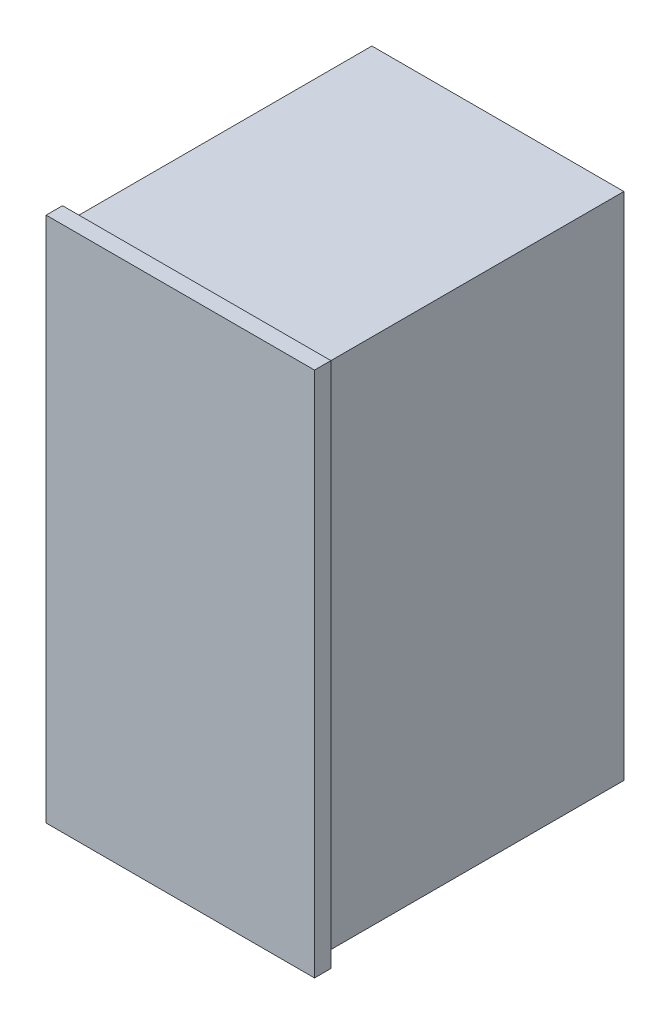
ISO-10303-21;
HEADER;
FILE_DESCRIPTION(('STEP AP214'),'2;1');
FILE_NAME('part.step','',(''),(''),'','','');
FILE_SCHEMA(('AUTOMOTIVE_DESIGN { 1 0 10303 214 1 1 1 1 }'));
ENDSEC;
DATA;
#1=APPLICATION_CONTEXT('core data for automotive mechanical design processes');
#2=APPLICATION_PROTOCOL_DEFINITION('international standard','automotive_design',2000,#1);
#3=PRODUCT_CONTEXT('',#1,'mechanical');
#4=PRODUCT('Part','Part','',(#3));
#5=PRODUCT_RELATED_PRODUCT_CATEGORY('part','',(#4));
#6=PRODUCT_DEFINITION_FORMATION('','',#4);
#7=PRODUCT_DEFINITION_CONTEXT('part definition',#1,'design');
#8=PRODUCT_DEFINITION('design','',#6,#7);
#9=PRODUCT_DEFINITION_SHAPE('','',#8);
#10=(LENGTH_UNIT() NAMED_UNIT(*) SI_UNIT(.MILLI.,.METRE.));
#11=(NAMED_UNIT(*) PLANE_ANGLE_UNIT() SI_UNIT($,.RADIAN.));
#12=(NAMED_UNIT(*) SI_UNIT($,.STERADIAN.) SOLID_ANGLE_UNIT());
#13=UNCERTAINTY_MEASURE_WITH_UNIT(LENGTH_MEASURE(1.E-05),#10,'distance_accuracy_value','');
#14=(GEOMETRIC_REPRESENTATION_CONTEXT(3) GLOBAL_UNCERTAINTY_ASSIGNED_CONTEXT((#13)) GLOBAL_UNIT_ASSIGNED_CONTEXT((#10,
#11,#12)) REPRESENTATION_CONTEXT('',''));
#15=CARTESIAN_POINT('',(0.,0.,0.));
#16=DIRECTION('',(0.,0.,1.));
#17=DIRECTION('',(1.,0.,0.));
#18=AXIS2_PLACEMENT_3D('',#15,#16,#17);
#19=CARTESIAN_POINT('',(0.,249.,0.));
#20=DIRECTION('',(1.,0.,0.));
#21=DIRECTION('',(0.,0.,-1.));
#22=AXIS2_PLACEMENT_3D('',#19,#20,#21);
#23=PLANE('',#22);
#24=DIRECTION('',(0.,0.,1.));
#25=VECTOR('',#24,1.);
#26=CARTESIAN_POINT('',(0.,0.,0.));
#27=LINE('',#26,#25);
#28=CARTESIAN_POINT('',(0.,0.,-147.));
#29=VERTEX_POINT('',#28);
#30=CARTESIAN_POINT('',(0.,0.,0.));
#31=VERTEX_POINT('',#30);
#32=EDGE_CURVE('E165',#29,#31,#27,.T.);
#33=ORIENTED_EDGE('',*,*,#32,.T.);
#34=DIRECTION('',(0.,-1.,0.));
#35=VECTOR('',#34,1.);
#36=CARTESIAN_POINT('',(0.,249.,0.));
#37=LINE('',#36,#35);
#38=CARTESIAN_POINT('',(0.,249.,0.));
#39=VERTEX_POINT('',#38);
#40=EDGE_CURVE('E11',#39,#31,#37,.T.);
#41=ORIENTED_EDGE('',*,*,#40,.F.);
#42=DIRECTION('',(0.,0.,1.));
#43=VECTOR('',#42,1.);
#44=CARTESIAN_POINT('',(0.,249.,0.));
#45=LINE('',#44,#43);
#46=CARTESIAN_POINT('',(0.,249.,-147.));
#47=VERTEX_POINT('',#46);
#48=EDGE_CURVE('E85',#47,#39,#45,.T.);
#49=ORIENTED_EDGE('',*,*,#48,.F.);
#50=DIRECTION('',(0.,-1.,0.));
#51=VECTOR('',#50,1.);
#52=CARTESIAN_POINT('',(0.,249.,-147.));
#53=LINE('',#52,#51);
#54=EDGE_CURVE('E181',#47,#29,#53,.T.);
#55=ORIENTED_EDGE('',*,*,#54,.T.);
#56=EDGE_LOOP('',(#33,#41,#49,#55));
#57=FACE_BOUND('',#56,.T.);
#58=ADVANCED_FACE('F43',(#57),#23,.F.);
#59=CARTESIAN_POINT('',(123.,249.,0.));
#60=DIRECTION('',(-1.,0.,0.));
#61=DIRECTION('',(0.,0.,1.));
#62=AXIS2_PLACEMENT_3D('',#59,#60,#61);
#63=PLANE('',#62);
#64=DIRECTION('',(0.,0.,-1.));
#65=VECTOR('',#64,1.);
#66=CARTESIAN_POINT('',(123.,0.,0.));
#67=LINE('',#66,#65);
#68=CARTESIAN_POINT('',(123.,0.,0.));
#69=VERTEX_POINT('',#68);
#70=CARTESIAN_POINT('',(123.,0.,-147.));
#71=VERTEX_POINT('',#70);
#72=EDGE_CURVE('E74',#69,#71,#67,.T.);
#73=ORIENTED_EDGE('',*,*,#72,.T.);
#74=DIRECTION('',(0.,-1.,0.));
#75=VECTOR('',#74,1.);
#76=CARTESIAN_POINT('',(123.,249.,-147.));
#77=LINE('',#76,#75);
#78=CARTESIAN_POINT('',(123.,249.,-147.));
#79=VERTEX_POINT('',#78);
#80=EDGE_CURVE('E194',#79,#71,#77,.T.);
#81=ORIENTED_EDGE('',*,*,#80,.F.);
#82=DIRECTION('',(0.,0.,-1.));
#83=VECTOR('',#82,1.);
#84=CARTESIAN_POINT('',(123.,249.,0.));
#85=LINE('',#84,#83);
#86=CARTESIAN_POINT('',(123.,249.,0.));
#87=VERTEX_POINT('',#86);
#88=EDGE_CURVE('E176',#87,#79,#85,.T.);
#89=ORIENTED_EDGE('',*,*,#88,.F.);
#90=DIRECTION('',(0.,-1.,0.));
#91=VECTOR('',#90,1.);
#92=CARTESIAN_POINT('',(123.,249.,0.));
#93=LINE('',#92,#91);
#94=EDGE_CURVE('E52',#87,#69,#93,.T.);
#95=ORIENTED_EDGE('',*,*,#94,.T.);
#96=EDGE_LOOP('',(#73,#81,#89,#95));
#97=FACE_BOUND('',#96,.T.);
#98=ADVANCED_FACE('F199',(#97),#63,.F.);
#99=CARTESIAN_POINT('',(0.,249.,-147.));
#100=DIRECTION('',(0.,0.,1.));
#101=DIRECTION('',(1.,0.,0.));
#102=AXIS2_PLACEMENT_3D('',#99,#100,#101);
#103=PLANE('',#102);
#104=DIRECTION('',(-1.,0.,0.));
#105=VECTOR('',#104,1.);
#106=CARTESIAN_POINT('',(0.,0.,-147.));
#107=LINE('',#106,#105);
#108=EDGE_CURVE('E80',#71,#29,#107,.T.);
#109=ORIENTED_EDGE('',*,*,#108,.T.);
#110=ORIENTED_EDGE('',*,*,#54,.F.);
#111=DIRECTION('',(-1.,0.,0.));
#112=VECTOR('',#111,1.);
#113=CARTESIAN_POINT('',(0.,249.,-147.));
#114=LINE('',#113,#112);
#115=EDGE_CURVE('E60',#79,#47,#114,.T.);
#116=ORIENTED_EDGE('',*,*,#115,.F.);
#117=ORIENTED_EDGE('',*,*,#80,.T.);
#118=EDGE_LOOP('',(#109,#110,#116,#117));
#119=FACE_BOUND('',#118,.T.);
#120=ADVANCED_FACE('F209',(#119),#103,.F.);
#121=CARTESIAN_POINT('',(0.,249.,0.));
#122=DIRECTION('',(0.,-1.,0.));
#123=DIRECTION('',(0.,0.,-1.));
#124=AXIS2_PLACEMENT_3D('',#121,#122,#123);
#125=PLANE('',#124);
#126=ORIENTED_EDGE('',*,*,#48,.T.);
#127=DIRECTION('',(1.,0.,0.));
#128=VECTOR('',#127,1.);
#129=CARTESIAN_POINT('',(0.,249.,0.));
#130=LINE('',#129,#128);
#131=EDGE_CURVE('E173',#39,#87,#130,.T.);
#132=ORIENTED_EDGE('',*,*,#131,.T.);
#133=ORIENTED_EDGE('',*,*,#88,.T.);
#134=ORIENTED_EDGE('',*,*,#115,.T.);
#135=EDGE_LOOP('',(#126,#132,#133,#134));
#136=FACE_BOUND('',#135,.T.);
#137=ADVANCED_FACE('F211',(#136),#125,.F.);
#138=CARTESIAN_POINT('',(0.,0.,0.));
#139=DIRECTION('',(0.,-1.,0.));
#140=DIRECTION('',(0.,0.,-1.));
#141=AXIS2_PLACEMENT_3D('',#138,#139,#140);
#142=PLANE('',#141);
#143=ORIENTED_EDGE('',*,*,#32,.F.);
#144=ORIENTED_EDGE('',*,*,#108,.F.);
#145=ORIENTED_EDGE('',*,*,#72,.F.);
#146=DIRECTION('',(1.,0.,0.));
#147=VECTOR('',#146,1.);
#148=CARTESIAN_POINT('',(0.,0.,0.));
#149=LINE('',#148,#147);
#150=EDGE_CURVE('E184',#31,#69,#149,.T.);
#151=ORIENTED_EDGE('',*,*,#150,.F.);
#152=EDGE_LOOP('',(#143,#144,#145,#151));
#153=FACE_BOUND('',#152,.T.);
#154=ADVANCED_FACE('F205',(#153),#142,.T.);
#155=CARTESIAN_POINT('',(-4.,-4.,8.));
#156=DIRECTION('',(-1.,0.,0.));
#157=DIRECTION('',(0.,0.,1.));
#158=AXIS2_PLACEMENT_3D('',#155,#156,#157);
#159=PLANE('',#158);
#160=DIRECTION('',(0.,1.,0.));
#161=VECTOR('',#160,1.);
#162=CARTESIAN_POINT('',(-4.,-4.,8.));
#163=LINE('',#162,#161);
#164=CARTESIAN_POINT('',(-4.,-4.,8.));
#165=VERTEX_POINT('',#164);
#166=CARTESIAN_POINT('',(-4.,253.,8.));
#167=VERTEX_POINT('',#166);
#168=EDGE_CURVE('E116',#165,#167,#163,.T.);
#169=ORIENTED_EDGE('',*,*,#168,.T.);
#170=DIRECTION('',(0.,0.,1.));
#171=VECTOR('',#170,1.);
#172=CARTESIAN_POINT('',(-4.,253.,8.));
#173=LINE('',#172,#171);
#174=CARTESIAN_POINT('',(-4.,253.,0.));
#175=VERTEX_POINT('',#174);
#176=EDGE_CURVE('E120',#175,#167,#173,.T.);
#177=ORIENTED_EDGE('',*,*,#176,.F.);
#178=DIRECTION('',(0.,1.,0.));
#179=VECTOR('',#178,1.);
#180=CARTESIAN_POINT('',(-4.,-4.,0.));
#181=LINE('',#180,#179);
#182=CARTESIAN_POINT('',(-4.,-4.,0.));
#183=VERTEX_POINT('',#182);
#184=EDGE_CURVE('E162',#183,#175,#181,.T.);
#185=ORIENTED_EDGE('',*,*,#184,.F.);
#186=DIRECTION('',(0.,0.,1.));
#187=VECTOR('',#186,1.);
#188=CARTESIAN_POINT('',(-4.,-4.,8.));
#189=LINE('',#188,#187);
#190=EDGE_CURVE('E122',#183,#165,#189,.T.);
#191=ORIENTED_EDGE('',*,*,#190,.T.);
#192=EDGE_LOOP('',(#169,#177,#185,#191));
#193=FACE_BOUND('',#192,.T.);
#194=ADVANCED_FACE('F118',(#193),#159,.T.);
#195=CARTESIAN_POINT('',(-4.,-4.,0.));
#196=DIRECTION('',(0.,0.,-1.));
#197=DIRECTION('',(-1.,0.,0.));
#198=AXIS2_PLACEMENT_3D('',#195,#196,#197);
#199=PLANE('',#198);
#200=ORIENTED_EDGE('',*,*,#40,.T.);
#201=ORIENTED_EDGE('',*,*,#150,.T.);
#202=ORIENTED_EDGE('',*,*,#94,.F.);
#203=ORIENTED_EDGE('',*,*,#131,.F.);
#204=EDGE_LOOP('',(#200,#201,#202,#203));
#205=FACE_BOUND('',#204,.T.);
#206=ORIENTED_EDGE('',*,*,#184,.T.);
#207=DIRECTION('',(-1.,0.,0.));
#208=VECTOR('',#207,1.);
#209=CARTESIAN_POINT('',(-4.,253.,0.));
#210=LINE('',#209,#208);
#211=CARTESIAN_POINT('',(127.,253.,0.));
#212=VERTEX_POINT('',#211);
#213=EDGE_CURVE('E142',#212,#175,#210,.T.);
#214=ORIENTED_EDGE('',*,*,#213,.F.);
#215=DIRECTION('',(0.,1.,0.));
#216=VECTOR('',#215,1.);
#217=CARTESIAN_POINT('',(127.,-4.,0.));
#218=LINE('',#217,#216);
#219=CARTESIAN_POINT('',(127.,-4.,0.));
#220=VERTEX_POINT('',#219);
#221=EDGE_CURVE('E166',#220,#212,#218,.T.);
#222=ORIENTED_EDGE('',*,*,#221,.F.);
#223=DIRECTION('',(-1.,0.,0.));
#224=VECTOR('',#223,1.);
#225=CARTESIAN_POINT('',(-4.,-4.,0.));
#226=LINE('',#225,#224);
#227=EDGE_CURVE('E128',#220,#183,#226,.T.);
#228=ORIENTED_EDGE('',*,*,#227,.T.);
#229=EDGE_LOOP('',(#206,#214,#222,#228));
#230=FACE_BOUND('',#229,.T.);
#231=ADVANCED_FACE('F206',(#205,#230),#199,.T.);
#232=CARTESIAN_POINT('',(127.,-4.,0.));
#233=DIRECTION('',(1.,0.,0.));
#234=DIRECTION('',(0.,0.,-1.));
#235=AXIS2_PLACEMENT_3D('',#232,#233,#234);
#236=PLANE('',#235);
#237=ORIENTED_EDGE('',*,*,#221,.T.);
#238=DIRECTION('',(0.,0.,-1.));
#239=VECTOR('',#238,1.);
#240=CARTESIAN_POINT('',(127.,253.,0.));
#241=LINE('',#240,#239);
#242=CARTESIAN_POINT('',(127.,253.,7.99999999999998));
#243=VERTEX_POINT('',#242);
#244=EDGE_CURVE('E137',#243,#212,#241,.T.);
#245=ORIENTED_EDGE('',*,*,#244,.F.);
#246=DIRECTION('',(0.,1.,0.));
#247=VECTOR('',#246,1.);
#248=CARTESIAN_POINT('',(127.,-4.,7.99999999999998));
#249=LINE('',#248,#247);
#250=CARTESIAN_POINT('',(127.,-4.,7.99999999999998));
#251=VERTEX_POINT('',#250);
#252=EDGE_CURVE('E127',#251,#243,#249,.T.);
#253=ORIENTED_EDGE('',*,*,#252,.F.);
#254=DIRECTION('',(0.,0.,-1.));
#255=VECTOR('',#254,1.);
#256=CARTESIAN_POINT('',(127.,-4.,0.));
#257=LINE('',#256,#255);
#258=EDGE_CURVE('E155',#251,#220,#257,.T.);
#259=ORIENTED_EDGE('',*,*,#258,.T.);
#260=EDGE_LOOP('',(#237,#245,#253,#259));
#261=FACE_BOUND('',#260,.T.);
#262=ADVANCED_FACE('F253',(#261),#236,.T.);
#263=CARTESIAN_POINT('',(127.,-4.,7.99999999999998));
#264=DIRECTION('',(0.,0.,1.));
#265=DIRECTION('',(1.,0.,0.));
#266=AXIS2_PLACEMENT_3D('',#263,#264,#265);
#267=PLANE('',#266);
#268=ORIENTED_EDGE('',*,*,#252,.T.);
#269=DIRECTION('',(1.,0.,0.));
#270=VECTOR('',#269,1.);
#271=CARTESIAN_POINT('',(127.,253.,7.99999999999998));
#272=LINE('',#271,#270);
#273=EDGE_CURVE('E131',#167,#243,#272,.T.);
#274=ORIENTED_EDGE('',*,*,#273,.F.);
#275=ORIENTED_EDGE('',*,*,#168,.F.);
#276=DIRECTION('',(1.,0.,0.));
#277=VECTOR('',#276,1.);
#278=CARTESIAN_POINT('',(127.,-4.,7.99999999999998));
#279=LINE('',#278,#277);
#280=EDGE_CURVE('E152',#165,#251,#279,.T.);
#281=ORIENTED_EDGE('',*,*,#280,.T.);
#282=EDGE_LOOP('',(#268,#274,#275,#281));
#283=FACE_BOUND('',#282,.T.);
#284=ADVANCED_FACE('F132',(#283),#267,.T.);
#285=CARTESIAN_POINT('',(0.,-4.,0.));
#286=DIRECTION('',(0.,-1.,0.));
#287=DIRECTION('',(0.,0.,-1.));
#288=AXIS2_PLACEMENT_3D('',#285,#286,#287);
#289=PLANE('',#288);
#290=ORIENTED_EDGE('',*,*,#190,.F.);
#291=ORIENTED_EDGE('',*,*,#227,.F.);
#292=ORIENTED_EDGE('',*,*,#258,.F.);
#293=ORIENTED_EDGE('',*,*,#280,.F.);
#294=EDGE_LOOP('',(#290,#291,#292,#293));
#295=FACE_BOUND('',#294,.T.);
#296=ADVANCED_FACE('F273',(#295),#289,.T.);
#297=CARTESIAN_POINT('',(0.,253.,0.));
#298=DIRECTION('',(0.,-1.,0.));
#299=DIRECTION('',(0.,0.,-1.));
#300=AXIS2_PLACEMENT_3D('',#297,#298,#299);
#301=PLANE('',#300);
#302=ORIENTED_EDGE('',*,*,#176,.T.);
#303=ORIENTED_EDGE('',*,*,#273,.T.);
#304=ORIENTED_EDGE('',*,*,#244,.T.);
#305=ORIENTED_EDGE('',*,*,#213,.T.);
#306=EDGE_LOOP('',(#302,#303,#304,#305));
#307=FACE_BOUND('',#306,.T.);
#308=ADVANCED_FACE('F140',(#307),#301,.F.);
#309=CLOSED_SHELL('',(#58,#98,#120,#137,#154,#194,#231,#262,#284,#296,#308));
#310=MANIFOLD_SOLID_BREP('B2',#309);
#311=ADVANCED_BREP_SHAPE_REPRESENTATION('',(#18,#310),#14);
#312=SHAPE_DEFINITION_REPRESENTATION(#9,#311);
ENDSEC;
END-ISO-10303-21;
